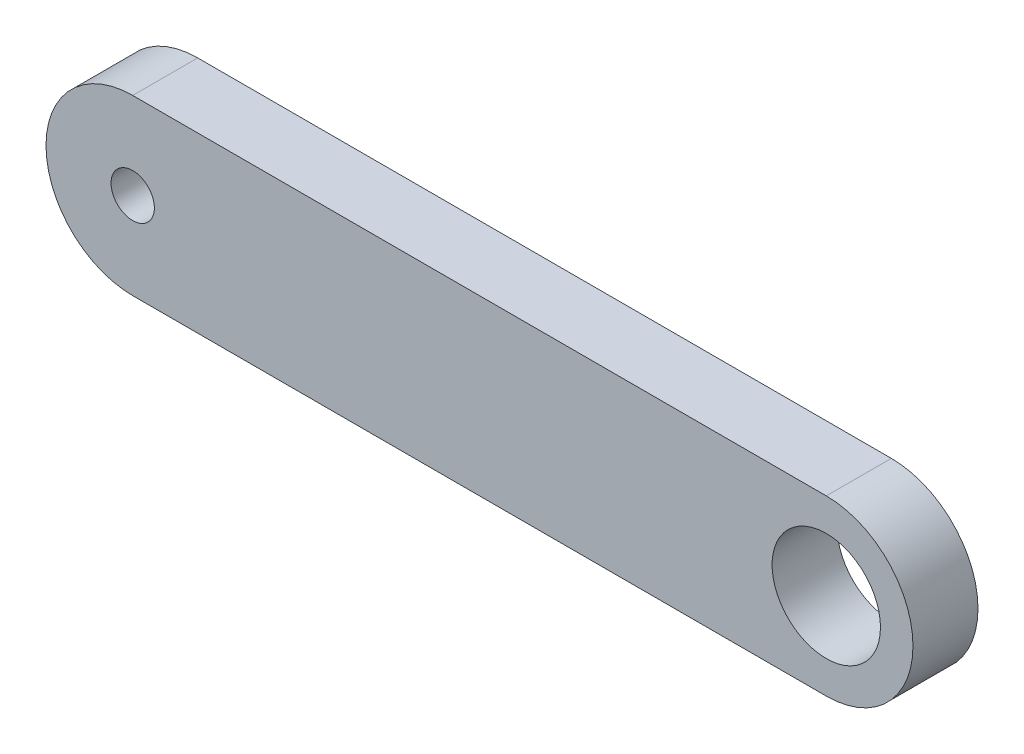
ISO-10303-21;
HEADER;
FILE_DESCRIPTION(('STEP AP214'),'2;1');
FILE_NAME('part.step','',(''),(''),'','','');
FILE_SCHEMA(('AUTOMOTIVE_DESIGN { 1 0 10303 214 1 1 1 1 }'));
ENDSEC;
DATA;
#1=APPLICATION_CONTEXT('core data for automotive mechanical design processes');
#2=APPLICATION_PROTOCOL_DEFINITION('international standard','automotive_design',2000,#1);
#3=PRODUCT_CONTEXT('',#1,'mechanical');
#4=PRODUCT('Part','Part','',(#3));
#5=PRODUCT_RELATED_PRODUCT_CATEGORY('part','',(#4));
#6=PRODUCT_DEFINITION_FORMATION('','',#4);
#7=PRODUCT_DEFINITION_CONTEXT('part definition',#1,'design');
#8=PRODUCT_DEFINITION('design','',#6,#7);
#9=PRODUCT_DEFINITION_SHAPE('','',#8);
#10=(LENGTH_UNIT() NAMED_UNIT(*) SI_UNIT(.MILLI.,.METRE.));
#11=(NAMED_UNIT(*) PLANE_ANGLE_UNIT() SI_UNIT($,.RADIAN.));
#12=(NAMED_UNIT(*) SI_UNIT($,.STERADIAN.) SOLID_ANGLE_UNIT());
#13=UNCERTAINTY_MEASURE_WITH_UNIT(LENGTH_MEASURE(1.E-05),#10,'distance_accuracy_value','');
#14=(GEOMETRIC_REPRESENTATION_CONTEXT(3) GLOBAL_UNCERTAINTY_ASSIGNED_CONTEXT((#13)) GLOBAL_UNIT_ASSIGNED_CONTEXT((#10,
#11,#12)) REPRESENTATION_CONTEXT('',''));
#15=CARTESIAN_POINT('',(0.,0.,0.));
#16=DIRECTION('',(0.,0.,1.));
#17=DIRECTION('',(1.,0.,0.));
#18=AXIS2_PLACEMENT_3D('',#15,#16,#17);
#19=CARTESIAN_POINT('',(16.,0.,3.));
#20=DIRECTION('',(0.,0.,-1.));
#21=DIRECTION('',(-1.,0.,0.));
#22=AXIS2_PLACEMENT_3D('',#19,#20,#21);
#23=PLANE('',#22);
#24=CARTESIAN_POINT('',(16.,0.,3.));
#25=DIRECTION('',(0.,0.,1.));
#26=DIRECTION('',(-1.,0.,0.));
#27=AXIS2_PLACEMENT_3D('',#24,#25,#26);
#28=CIRCLE('',#27,4.);
#29=CARTESIAN_POINT('',(16.,-4.,3.));
#30=VERTEX_POINT('',#29);
#31=CARTESIAN_POINT('',(16.,4.,3.));
#32=VERTEX_POINT('',#31);
#33=EDGE_CURVE('E91',#30,#32,#28,.T.);
#34=ORIENTED_EDGE('',*,*,#33,.T.);
#35=DIRECTION('',(-1.,0.,0.));
#36=VECTOR('',#35,1.);
#37=CARTESIAN_POINT('',(-16.,4.,3.));
#38=LINE('',#37,#36);
#39=CARTESIAN_POINT('',(-16.,4.,3.));
#40=VERTEX_POINT('',#39);
#41=EDGE_CURVE('E86',#32,#40,#38,.T.);
#42=ORIENTED_EDGE('',*,*,#41,.T.);
#43=CARTESIAN_POINT('',(-16.,0.,3.));
#44=DIRECTION('',(0.,0.,1.));
#45=DIRECTION('',(1.,0.,0.));
#46=AXIS2_PLACEMENT_3D('',#43,#44,#45);
#47=CIRCLE('',#46,4.);
#48=CARTESIAN_POINT('',(-16.,-4.,3.));
#49=VERTEX_POINT('',#48);
#50=EDGE_CURVE('E89',#40,#49,#47,.T.);
#51=ORIENTED_EDGE('',*,*,#50,.T.);
#52=DIRECTION('',(1.,0.,0.));
#53=VECTOR('',#52,1.);
#54=CARTESIAN_POINT('',(-16.,-4.,3.));
#55=LINE('',#54,#53);
#56=EDGE_CURVE('E56',#49,#30,#55,.T.);
#57=ORIENTED_EDGE('',*,*,#56,.T.);
#58=EDGE_LOOP('',(#34,#42,#51,#57));
#59=FACE_BOUND('',#58,.T.);
#60=CARTESIAN_POINT('',(-16.,0.,3.));
#61=DIRECTION('',(0.,0.,1.));
#62=DIRECTION('',(1.,0.,0.));
#63=AXIS2_PLACEMENT_3D('',#60,#61,#62);
#64=CIRCLE('',#63,1.);
#65=CARTESIAN_POINT('',(-15.,0.,3.));
#66=VERTEX_POINT('',#65);
#67=EDGE_CURVE('E106',#66,#66,#64,.T.);
#68=ORIENTED_EDGE('',*,*,#67,.F.);
#69=EDGE_LOOP('',(#68));
#70=FACE_BOUND('',#69,.T.);
#71=CARTESIAN_POINT('',(16.,0.,3.));
#72=DIRECTION('',(0.,0.,1.));
#73=DIRECTION('',(1.,0.,0.));
#74=AXIS2_PLACEMENT_3D('',#71,#72,#73);
#75=CIRCLE('',#74,2.5);
#76=CARTESIAN_POINT('',(18.5,0.,3.));
#77=VERTEX_POINT('',#76);
#78=EDGE_CURVE('E121',#77,#77,#75,.T.);
#79=ORIENTED_EDGE('',*,*,#78,.F.);
#80=EDGE_LOOP('',(#79));
#81=FACE_BOUND('',#80,.T.);
#82=ADVANCED_FACE('F39',(#59,#70,#81),#23,.F.);
#83=CARTESIAN_POINT('',(16.,0.,0.));
#84=DIRECTION('',(0.,0.,-1.));
#85=DIRECTION('',(-1.,0.,0.));
#86=AXIS2_PLACEMENT_3D('',#83,#84,#85);
#87=PLANE('',#86);
#88=CARTESIAN_POINT('',(-16.,0.,0.));
#89=DIRECTION('',(0.,0.,1.));
#90=DIRECTION('',(1.,0.,0.));
#91=AXIS2_PLACEMENT_3D('',#88,#89,#90);
#92=CIRCLE('',#91,1.);
#93=CARTESIAN_POINT('',(-15.,0.,0.));
#94=VERTEX_POINT('',#93);
#95=EDGE_CURVE('E118',#94,#94,#92,.T.);
#96=ORIENTED_EDGE('',*,*,#95,.T.);
#97=EDGE_LOOP('',(#96));
#98=FACE_BOUND('',#97,.T.);
#99=CARTESIAN_POINT('',(16.,0.,0.));
#100=DIRECTION('',(0.,0.,1.));
#101=DIRECTION('',(-1.,0.,0.));
#102=AXIS2_PLACEMENT_3D('',#99,#100,#101);
#103=CIRCLE('',#102,4.);
#104=CARTESIAN_POINT('',(16.,-4.,0.));
#105=VERTEX_POINT('',#104);
#106=CARTESIAN_POINT('',(16.,4.,0.));
#107=VERTEX_POINT('',#106);
#108=EDGE_CURVE('E103',#105,#107,#103,.T.);
#109=ORIENTED_EDGE('',*,*,#108,.F.);
#110=DIRECTION('',(1.,0.,0.));
#111=VECTOR('',#110,1.);
#112=CARTESIAN_POINT('',(-16.,-4.,0.));
#113=LINE('',#112,#111);
#114=CARTESIAN_POINT('',(-16.,-4.,0.));
#115=VERTEX_POINT('',#114);
#116=EDGE_CURVE('E79',#115,#105,#113,.T.);
#117=ORIENTED_EDGE('',*,*,#116,.F.);
#118=CARTESIAN_POINT('',(-16.,0.,0.));
#119=DIRECTION('',(0.,0.,1.));
#120=DIRECTION('',(1.,0.,0.));
#121=AXIS2_PLACEMENT_3D('',#118,#119,#120);
#122=CIRCLE('',#121,4.);
#123=CARTESIAN_POINT('',(-16.,4.,0.));
#124=VERTEX_POINT('',#123);
#125=EDGE_CURVE('E73',#124,#115,#122,.T.);
#126=ORIENTED_EDGE('',*,*,#125,.F.);
#127=DIRECTION('',(-1.,0.,0.));
#128=VECTOR('',#127,1.);
#129=CARTESIAN_POINT('',(-16.,4.,0.));
#130=LINE('',#129,#128);
#131=EDGE_CURVE('E95',#107,#124,#130,.T.);
#132=ORIENTED_EDGE('',*,*,#131,.F.);
#133=EDGE_LOOP('',(#109,#117,#126,#132));
#134=FACE_BOUND('',#133,.T.);
#135=CARTESIAN_POINT('',(16.,0.,0.));
#136=DIRECTION('',(0.,0.,1.));
#137=DIRECTION('',(1.,0.,0.));
#138=AXIS2_PLACEMENT_3D('',#135,#136,#137);
#139=CIRCLE('',#138,2.5);
#140=CARTESIAN_POINT('',(18.5,0.,0.));
#141=VERTEX_POINT('',#140);
#142=EDGE_CURVE('E124',#141,#141,#139,.T.);
#143=ORIENTED_EDGE('',*,*,#142,.T.);
#144=EDGE_LOOP('',(#143));
#145=FACE_BOUND('',#144,.T.);
#146=ADVANCED_FACE('F114',(#98,#134,#145),#87,.T.);
#147=CARTESIAN_POINT('',(16.,0.,3.));
#148=DIRECTION('',(0.,0.,-1.));
#149=DIRECTION('',(-1.,0.,0.));
#150=AXIS2_PLACEMENT_3D('',#147,#148,#149);
#151=CYLINDRICAL_SURFACE('',#150,4.);
#152=ORIENTED_EDGE('',*,*,#108,.T.);
#153=DIRECTION('',(0.,0.,-1.));
#154=VECTOR('',#153,1.);
#155=CARTESIAN_POINT('',(16.,4.,3.));
#156=LINE('',#155,#154);
#157=EDGE_CURVE('E11',#32,#107,#156,.T.);
#158=ORIENTED_EDGE('',*,*,#157,.F.);
#159=ORIENTED_EDGE('',*,*,#33,.F.);
#160=DIRECTION('',(0.,0.,-1.));
#161=VECTOR('',#160,1.);
#162=CARTESIAN_POINT('',(16.,-4.,3.));
#163=LINE('',#162,#161);
#164=EDGE_CURVE('E99',#30,#105,#163,.T.);
#165=ORIENTED_EDGE('',*,*,#164,.T.);
#166=EDGE_LOOP('',(#152,#158,#159,#165));
#167=FACE_BOUND('',#166,.T.);
#168=ADVANCED_FACE('F41',(#167),#151,.T.);
#169=CARTESIAN_POINT('',(-16.,4.,3.));
#170=DIRECTION('',(0.,-1.,0.));
#171=DIRECTION('',(0.,0.,-1.));
#172=AXIS2_PLACEMENT_3D('',#169,#170,#171);
#173=PLANE('',#172);
#174=ORIENTED_EDGE('',*,*,#131,.T.);
#175=DIRECTION('',(0.,0.,-1.));
#176=VECTOR('',#175,1.);
#177=CARTESIAN_POINT('',(-16.,4.,3.));
#178=LINE('',#177,#176);
#179=EDGE_CURVE('E48',#40,#124,#178,.T.);
#180=ORIENTED_EDGE('',*,*,#179,.F.);
#181=ORIENTED_EDGE('',*,*,#41,.F.);
#182=ORIENTED_EDGE('',*,*,#157,.T.);
#183=EDGE_LOOP('',(#174,#180,#181,#182));
#184=FACE_BOUND('',#183,.T.);
#185=ADVANCED_FACE('F94',(#184),#173,.F.);
#186=CARTESIAN_POINT('',(-16.,0.,3.));
#187=DIRECTION('',(0.,0.,-1.));
#188=DIRECTION('',(-1.,0.,0.));
#189=AXIS2_PLACEMENT_3D('',#186,#187,#188);
#190=CYLINDRICAL_SURFACE('',#189,4.);
#191=ORIENTED_EDGE('',*,*,#125,.T.);
#192=DIRECTION('',(0.,0.,-1.));
#193=VECTOR('',#192,1.);
#194=CARTESIAN_POINT('',(-16.,-4.,3.));
#195=LINE('',#194,#193);
#196=EDGE_CURVE('E96',#49,#115,#195,.T.);
#197=ORIENTED_EDGE('',*,*,#196,.F.);
#198=ORIENTED_EDGE('',*,*,#50,.F.);
#199=ORIENTED_EDGE('',*,*,#179,.T.);
#200=EDGE_LOOP('',(#191,#197,#198,#199));
#201=FACE_BOUND('',#200,.T.);
#202=ADVANCED_FACE('F97',(#201),#190,.T.);
#203=CARTESIAN_POINT('',(-16.,-4.,3.));
#204=DIRECTION('',(0.,1.,0.));
#205=DIRECTION('',(0.,0.,1.));
#206=AXIS2_PLACEMENT_3D('',#203,#204,#205);
#207=PLANE('',#206);
#208=ORIENTED_EDGE('',*,*,#116,.T.);
#209=ORIENTED_EDGE('',*,*,#164,.F.);
#210=ORIENTED_EDGE('',*,*,#56,.F.);
#211=ORIENTED_EDGE('',*,*,#196,.T.);
#212=EDGE_LOOP('',(#208,#209,#210,#211));
#213=FACE_BOUND('',#212,.T.);
#214=ADVANCED_FACE('F111',(#213),#207,.F.);
#215=CARTESIAN_POINT('',(-16.,0.,3.));
#216=DIRECTION('',(0.,0.,-1.));
#217=DIRECTION('',(-1.,0.,0.));
#218=AXIS2_PLACEMENT_3D('',#215,#216,#217);
#219=CYLINDRICAL_SURFACE('',#218,1.);
#220=ORIENTED_EDGE('',*,*,#67,.T.);
#221=EDGE_LOOP('',(#220));
#222=FACE_BOUND('',#221,.T.);
#223=ORIENTED_EDGE('',*,*,#95,.F.);
#224=EDGE_LOOP('',(#223));
#225=FACE_BOUND('',#224,.T.);
#226=ADVANCED_FACE('F141',(#222,#225),#219,.F.);
#227=CARTESIAN_POINT('',(16.,0.,3.));
#228=DIRECTION('',(0.,0.,-1.));
#229=DIRECTION('',(-1.,0.,0.));
#230=AXIS2_PLACEMENT_3D('',#227,#228,#229);
#231=CYLINDRICAL_SURFACE('',#230,2.5);
#232=ORIENTED_EDGE('',*,*,#78,.T.);
#233=EDGE_LOOP('',(#232));
#234=FACE_BOUND('',#233,.T.);
#235=ORIENTED_EDGE('',*,*,#142,.F.);
#236=EDGE_LOOP('',(#235));
#237=FACE_BOUND('',#236,.T.);
#238=ADVANCED_FACE('F130',(#234,#237),#231,.F.);
#239=CLOSED_SHELL('',(#82,#146,#168,#185,#202,#214,#226,#238));
#240=MANIFOLD_SOLID_BREP('B2',#239);
#241=ADVANCED_BREP_SHAPE_REPRESENTATION('',(#18,#240),#14);
#242=SHAPE_DEFINITION_REPRESENTATION(#9,#241);
ENDSEC;
END-ISO-10303-21;
